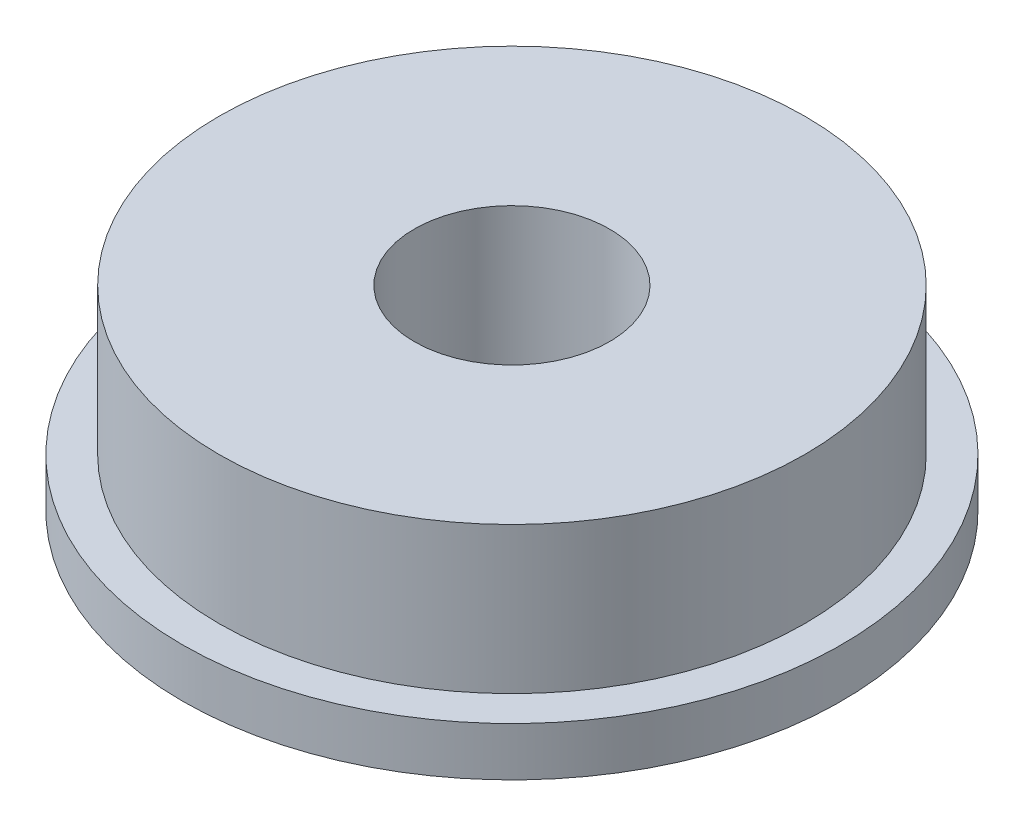
ISO-10303-21;
HEADER;
FILE_DESCRIPTION(('STEP AP214'),'2;1');
FILE_NAME('part.step','',(''),(''),'','','');
FILE_SCHEMA(('AUTOMOTIVE_DESIGN { 1 0 10303 214 1 1 1 1 }'));
ENDSEC;
DATA;
#1=APPLICATION_CONTEXT('core data for automotive mechanical design processes');
#2=APPLICATION_PROTOCOL_DEFINITION('international standard','automotive_design',2000,#1);
#3=PRODUCT_CONTEXT('',#1,'mechanical');
#4=PRODUCT('Part','Part','',(#3));
#5=PRODUCT_RELATED_PRODUCT_CATEGORY('part','',(#4));
#6=PRODUCT_DEFINITION_FORMATION('','',#4);
#7=PRODUCT_DEFINITION_CONTEXT('part definition',#1,'design');
#8=PRODUCT_DEFINITION('design','',#6,#7);
#9=PRODUCT_DEFINITION_SHAPE('','',#8);
#10=(LENGTH_UNIT() NAMED_UNIT(*) SI_UNIT(.MILLI.,.METRE.));
#11=(NAMED_UNIT(*) PLANE_ANGLE_UNIT() SI_UNIT($,.RADIAN.));
#12=(NAMED_UNIT(*) SI_UNIT($,.STERADIAN.) SOLID_ANGLE_UNIT());
#13=UNCERTAINTY_MEASURE_WITH_UNIT(LENGTH_MEASURE(1.E-05),#10,'distance_accuracy_value','');
#14=(GEOMETRIC_REPRESENTATION_CONTEXT(3) GLOBAL_UNCERTAINTY_ASSIGNED_CONTEXT((#13)) GLOBAL_UNIT_ASSIGNED_CONTEXT((#10,
#11,#12)) REPRESENTATION_CONTEXT('',''));
#15=CARTESIAN_POINT('',(0.,0.,0.));
#16=DIRECTION('',(0.,0.,1.));
#17=DIRECTION('',(1.,0.,0.));
#18=AXIS2_PLACEMENT_3D('',#15,#16,#17);
#19=CARTESIAN_POINT('',(0.,4.,0.));
#20=DIRECTION('',(0.,-1.,0.));
#21=DIRECTION('',(0.,0.,-1.));
#22=AXIS2_PLACEMENT_3D('',#19,#20,#21);
#23=CYLINDRICAL_SURFACE('',#22,2.);
#24=CARTESIAN_POINT('',(0.,4.,0.));
#25=DIRECTION('',(0.,1.,0.));
#26=DIRECTION('',(0.,0.,1.));
#27=AXIS2_PLACEMENT_3D('',#24,#25,#26);
#28=CIRCLE('',#27,2.);
#29=CARTESIAN_POINT('',(0.,4.,2.));
#30=VERTEX_POINT('',#29);
#31=EDGE_CURVE('E37',#30,#30,#28,.T.);
#32=ORIENTED_EDGE('',*,*,#31,.T.);
#33=EDGE_LOOP('',(#32));
#34=FACE_BOUND('',#33,.T.);
#35=CARTESIAN_POINT('',(0.,0.,0.));
#36=DIRECTION('',(0.,1.,0.));
#37=DIRECTION('',(0.,0.,1.));
#38=AXIS2_PLACEMENT_3D('',#35,#36,#37);
#39=CIRCLE('',#38,2.);
#40=CARTESIAN_POINT('',(0.,0.,2.));
#41=VERTEX_POINT('',#40);
#42=EDGE_CURVE('E33',#41,#41,#39,.T.);
#43=ORIENTED_EDGE('',*,*,#42,.F.);
#44=EDGE_LOOP('',(#43));
#45=FACE_BOUND('',#44,.T.);
#46=ADVANCED_FACE('F30',(#34,#45),#23,.F.);
#47=CARTESIAN_POINT('',(0.,4.,0.));
#48=DIRECTION('',(0.,-1.,0.));
#49=DIRECTION('',(0.,0.,-1.));
#50=AXIS2_PLACEMENT_3D('',#47,#48,#49);
#51=CYLINDRICAL_SURFACE('',#50,6.);
#52=CARTESIAN_POINT('',(0.,1.,0.));
#53=DIRECTION('',(0.,1.,0.));
#54=DIRECTION('',(0.,0.,1.));
#55=AXIS2_PLACEMENT_3D('',#52,#53,#54);
#56=CIRCLE('',#55,6.);
#57=CARTESIAN_POINT('',(0.,1.,6.));
#58=VERTEX_POINT('',#57);
#59=EDGE_CURVE('E46',#58,#58,#56,.T.);
#60=ORIENTED_EDGE('',*,*,#59,.T.);
#61=EDGE_LOOP('',(#60));
#62=FACE_BOUND('',#61,.T.);
#63=CARTESIAN_POINT('',(0.,4.,0.));
#64=DIRECTION('',(0.,1.,0.));
#65=DIRECTION('',(0.,0.,1.));
#66=AXIS2_PLACEMENT_3D('',#63,#64,#65);
#67=CIRCLE('',#66,6.);
#68=CARTESIAN_POINT('',(0.,4.,6.));
#69=VERTEX_POINT('',#68);
#70=EDGE_CURVE('E10',#69,#69,#67,.T.);
#71=ORIENTED_EDGE('',*,*,#70,.F.);
#72=EDGE_LOOP('',(#71));
#73=FACE_BOUND('',#72,.T.);
#74=ADVANCED_FACE('F53',(#62,#73),#51,.T.);
#75=CARTESIAN_POINT('',(0.,4.,0.));
#76=DIRECTION('',(0.,1.,0.));
#77=DIRECTION('',(0.,0.,1.));
#78=AXIS2_PLACEMENT_3D('',#75,#76,#77);
#79=PLANE('',#78);
#80=ORIENTED_EDGE('',*,*,#31,.F.);
#81=EDGE_LOOP('',(#80));
#82=FACE_BOUND('',#81,.T.);
#83=ORIENTED_EDGE('',*,*,#70,.T.);
#84=EDGE_LOOP('',(#83));
#85=FACE_BOUND('',#84,.T.);
#86=ADVANCED_FACE('F70',(#82,#85),#79,.T.);
#87=CARTESIAN_POINT('',(0.,0.,0.));
#88=DIRECTION('',(0.,1.,0.));
#89=DIRECTION('',(0.,0.,1.));
#90=AXIS2_PLACEMENT_3D('',#87,#88,#89);
#91=PLANE('',#90);
#92=ORIENTED_EDGE('',*,*,#42,.T.);
#93=EDGE_LOOP('',(#92));
#94=FACE_BOUND('',#93,.T.);
#95=CARTESIAN_POINT('',(0.,0.,0.));
#96=DIRECTION('',(0.,1.,0.));
#97=DIRECTION('',(0.,0.,1.));
#98=AXIS2_PLACEMENT_3D('',#95,#96,#97);
#99=CIRCLE('',#98,6.75);
#100=CARTESIAN_POINT('',(0.,0.,6.75));
#101=VERTEX_POINT('',#100);
#102=EDGE_CURVE('E43',#101,#101,#99,.T.);
#103=ORIENTED_EDGE('',*,*,#102,.F.);
#104=EDGE_LOOP('',(#103));
#105=FACE_BOUND('',#104,.T.);
#106=ADVANCED_FACE('F65',(#94,#105),#91,.F.);
#107=CARTESIAN_POINT('',(0.,1.,0.));
#108=DIRECTION('',(0.,-1.,0.));
#109=DIRECTION('',(0.,0.,-1.));
#110=AXIS2_PLACEMENT_3D('',#107,#108,#109);
#111=CYLINDRICAL_SURFACE('',#110,6.75);
#112=CARTESIAN_POINT('',(0.,1.,0.));
#113=DIRECTION('',(0.,1.,0.));
#114=DIRECTION('',(0.,0.,1.));
#115=AXIS2_PLACEMENT_3D('',#112,#113,#114);
#116=CIRCLE('',#115,6.75);
#117=CARTESIAN_POINT('',(0.,1.,6.75));
#118=VERTEX_POINT('',#117);
#119=EDGE_CURVE('E47',#118,#118,#116,.T.);
#120=ORIENTED_EDGE('',*,*,#119,.F.);
#121=EDGE_LOOP('',(#120));
#122=FACE_BOUND('',#121,.T.);
#123=ORIENTED_EDGE('',*,*,#102,.T.);
#124=EDGE_LOOP('',(#123));
#125=FACE_BOUND('',#124,.T.);
#126=ADVANCED_FACE('F59',(#122,#125),#111,.T.);
#127=CARTESIAN_POINT('',(0.,1.,0.));
#128=DIRECTION('',(0.,1.,0.));
#129=DIRECTION('',(0.,0.,1.));
#130=AXIS2_PLACEMENT_3D('',#127,#128,#129);
#131=PLANE('',#130);
#132=ORIENTED_EDGE('',*,*,#59,.F.);
#133=EDGE_LOOP('',(#132));
#134=FACE_BOUND('',#133,.T.);
#135=ORIENTED_EDGE('',*,*,#119,.T.);
#136=EDGE_LOOP('',(#135));
#137=FACE_BOUND('',#136,.T.);
#138=ADVANCED_FACE('F56',(#134,#137),#131,.T.);
#139=CLOSED_SHELL('',(#46,#74,#86,#106,#126,#138));
#140=MANIFOLD_SOLID_BREP('B2',#139);
#141=ADVANCED_BREP_SHAPE_REPRESENTATION('',(#18,#140),#14);
#142=SHAPE_DEFINITION_REPRESENTATION(#9,#141);
ENDSEC;
END-ISO-10303-21;
